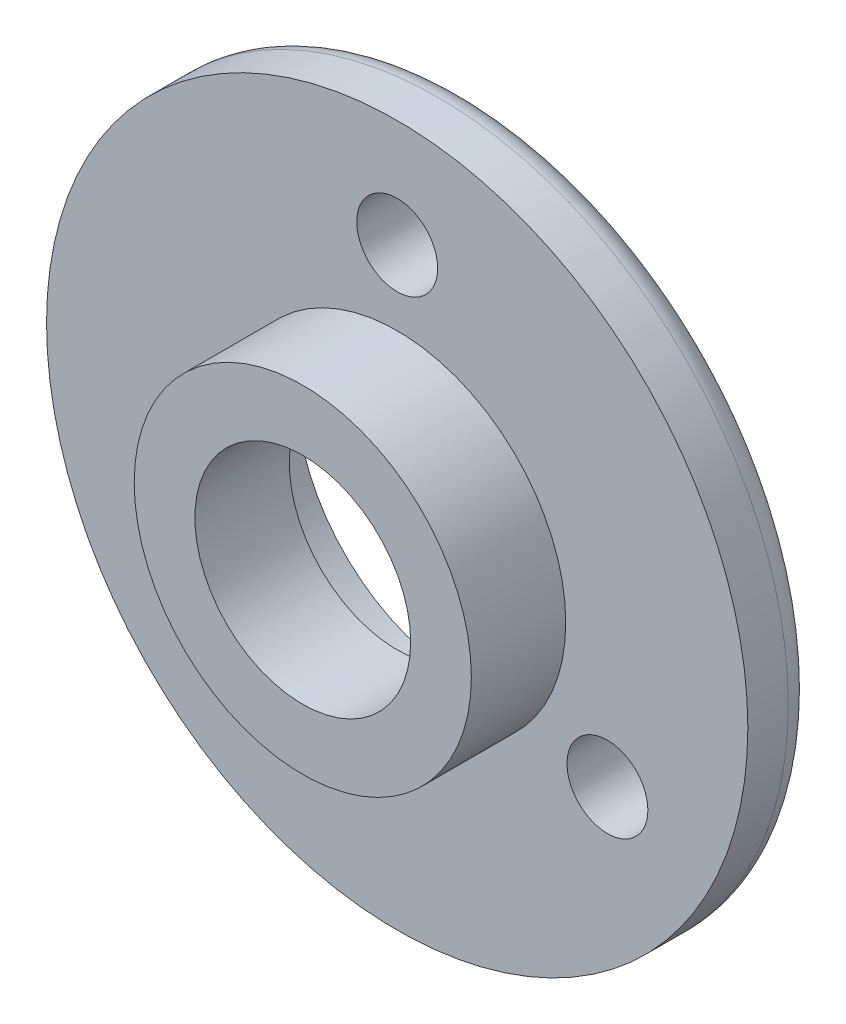
ISO-10303-21;
HEADER;
FILE_DESCRIPTION(('STEP AP214'),'2;1');
FILE_NAME('part.step','',(''),(''),'','','');
FILE_SCHEMA(('AUTOMOTIVE_DESIGN { 1 0 10303 214 1 1 1 1 }'));
ENDSEC;
DATA;
#1=APPLICATION_CONTEXT('core data for automotive mechanical design processes');
#2=APPLICATION_PROTOCOL_DEFINITION('international standard','automotive_design',2000,#1);
#3=PRODUCT_CONTEXT('',#1,'mechanical');
#4=PRODUCT('Part','Part','',(#3));
#5=PRODUCT_RELATED_PRODUCT_CATEGORY('part','',(#4));
#6=PRODUCT_DEFINITION_FORMATION('','',#4);
#7=PRODUCT_DEFINITION_CONTEXT('part definition',#1,'design');
#8=PRODUCT_DEFINITION('design','',#6,#7);
#9=PRODUCT_DEFINITION_SHAPE('','',#8);
#10=(LENGTH_UNIT() NAMED_UNIT(*) SI_UNIT(.MILLI.,.METRE.));
#11=(NAMED_UNIT(*) PLANE_ANGLE_UNIT() SI_UNIT($,.RADIAN.));
#12=(NAMED_UNIT(*) SI_UNIT($,.STERADIAN.) SOLID_ANGLE_UNIT());
#13=UNCERTAINTY_MEASURE_WITH_UNIT(LENGTH_MEASURE(1.E-05),#10,'distance_accuracy_value','');
#14=(GEOMETRIC_REPRESENTATION_CONTEXT(3) GLOBAL_UNCERTAINTY_ASSIGNED_CONTEXT((#13)) GLOBAL_UNIT_ASSIGNED_CONTEXT((#10,
#11,#12)) REPRESENTATION_CONTEXT('',''));
#15=CARTESIAN_POINT('',(0.,0.,0.));
#16=DIRECTION('',(0.,0.,1.));
#17=DIRECTION('',(1.,0.,0.));
#18=AXIS2_PLACEMENT_3D('',#15,#16,#17);
#19=CARTESIAN_POINT('',(0.,0.,5.));
#20=DIRECTION('',(0.,0.,-1.));
#21=DIRECTION('',(-1.,0.,0.));
#22=AXIS2_PLACEMENT_3D('',#19,#20,#21);
#23=CYLINDRICAL_SURFACE('',#22,26.);
#24=CARTESIAN_POINT('',(0.,0.,2.));
#25=DIRECTION('',(0.,0.,1.));
#26=DIRECTION('',(1.,0.,0.));
#27=AXIS2_PLACEMENT_3D('',#24,#25,#26);
#28=CIRCLE('',#27,26.);
#29=CARTESIAN_POINT('',(26.,0.,2.));
#30=VERTEX_POINT('',#29);
#31=EDGE_CURVE('E46',#30,#30,#28,.T.);
#32=ORIENTED_EDGE('',*,*,#31,.T.);
#33=EDGE_LOOP('',(#32));
#34=FACE_BOUND('',#33,.T.);
#35=CARTESIAN_POINT('',(0.,0.,5.));
#36=DIRECTION('',(0.,0.,1.));
#37=DIRECTION('',(1.,0.,0.));
#38=AXIS2_PLACEMENT_3D('',#35,#36,#37);
#39=CIRCLE('',#38,26.);
#40=CARTESIAN_POINT('',(26.,0.,5.));
#41=VERTEX_POINT('',#40);
#42=EDGE_CURVE('E65',#41,#41,#39,.T.);
#43=ORIENTED_EDGE('',*,*,#42,.F.);
#44=EDGE_LOOP('',(#43));
#45=FACE_BOUND('',#44,.T.);
#46=ADVANCED_FACE('F39',(#34,#45),#23,.T.);
#47=CARTESIAN_POINT('',(0.,0.,5.));
#48=DIRECTION('',(0.,0.,1.));
#49=DIRECTION('',(1.,0.,0.));
#50=AXIS2_PLACEMENT_3D('',#47,#48,#49);
#51=PLANE('',#50);
#52=CARTESIAN_POINT('',(0.,18.,5.));
#53=DIRECTION('',(0.,0.,1.));
#54=DIRECTION('',(1.,0.,0.));
#55=AXIS2_PLACEMENT_3D('',#52,#53,#54);
#56=CIRCLE('',#55,3.);
#57=CARTESIAN_POINT('',(3.,18.,5.));
#58=VERTEX_POINT('',#57);
#59=EDGE_CURVE('E50',#58,#58,#56,.T.);
#60=ORIENTED_EDGE('',*,*,#59,.F.);
#61=EDGE_LOOP('',(#60));
#62=FACE_BOUND('',#61,.T.);
#63=CARTESIAN_POINT('',(15.5884572681199,-9.,5.));
#64=DIRECTION('',(0.,0.,1.));
#65=DIRECTION('',(1.,0.,0.));
#66=AXIS2_PLACEMENT_3D('',#63,#64,#65);
#67=CIRCLE('',#66,3.);
#68=CARTESIAN_POINT('',(18.5884572681199,-9.,5.));
#69=VERTEX_POINT('',#68);
#70=EDGE_CURVE('E54',#69,#69,#67,.T.);
#71=ORIENTED_EDGE('',*,*,#70,.F.);
#72=EDGE_LOOP('',(#71));
#73=FACE_BOUND('',#72,.T.);
#74=CARTESIAN_POINT('',(-15.5884572681199,-9.00000000000001,5.));
#75=DIRECTION('',(0.,0.,1.));
#76=DIRECTION('',(1.,0.,0.));
#77=AXIS2_PLACEMENT_3D('',#74,#75,#76);
#78=CIRCLE('',#77,3.);
#79=CARTESIAN_POINT('',(-12.5884572681199,-9.00000000000001,5.));
#80=VERTEX_POINT('',#79);
#81=EDGE_CURVE('E60',#80,#80,#78,.T.);
#82=ORIENTED_EDGE('',*,*,#81,.F.);
#83=EDGE_LOOP('',(#82));
#84=FACE_BOUND('',#83,.T.);
#85=CARTESIAN_POINT('',(0.,0.,5.));
#86=DIRECTION('',(0.,0.,1.));
#87=DIRECTION('',(1.,0.,0.));
#88=AXIS2_PLACEMENT_3D('',#85,#86,#87);
#89=CIRCLE('',#88,12.5);
#90=CARTESIAN_POINT('',(12.5,0.,5.));
#91=VERTEX_POINT('',#90);
#92=EDGE_CURVE('E57',#91,#91,#89,.T.);
#93=ORIENTED_EDGE('',*,*,#92,.F.);
#94=EDGE_LOOP('',(#93));
#95=FACE_BOUND('',#94,.T.);
#96=ORIENTED_EDGE('',*,*,#42,.T.);
#97=EDGE_LOOP('',(#96));
#98=FACE_BOUND('',#97,.T.);
#99=ADVANCED_FACE('F81',(#62,#73,#84,#95,#98),#51,.T.);
#100=CARTESIAN_POINT('',(0.,0.,0.));
#101=DIRECTION('',(0.,0.,1.));
#102=DIRECTION('',(1.,0.,0.));
#103=AXIS2_PLACEMENT_3D('',#100,#101,#102);
#104=PLANE('',#103);
#105=CARTESIAN_POINT('',(0.,0.,0.));
#106=DIRECTION('',(0.,0.,1.));
#107=DIRECTION('',(1.,0.,0.));
#108=AXIS2_PLACEMENT_3D('',#105,#106,#107);
#109=CIRCLE('',#108,24.);
#110=CARTESIAN_POINT('',(24.,0.,0.));
#111=VERTEX_POINT('',#110);
#112=EDGE_CURVE('E11',#111,#111,#109,.F.);
#113=ORIENTED_EDGE('',*,*,#112,.T.);
#114=EDGE_LOOP('',(#113));
#115=FACE_BOUND('',#114,.T.);
#116=CARTESIAN_POINT('',(0.,18.,0.));
#117=DIRECTION('',(0.,0.,1.));
#118=DIRECTION('',(1.,0.,0.));
#119=AXIS2_PLACEMENT_3D('',#116,#117,#118);
#120=CIRCLE('',#119,3.);
#121=CARTESIAN_POINT('',(3.,18.,0.));
#122=VERTEX_POINT('',#121);
#123=EDGE_CURVE('E62',#122,#122,#120,.T.);
#124=ORIENTED_EDGE('',*,*,#123,.T.);
#125=EDGE_LOOP('',(#124));
#126=FACE_BOUND('',#125,.T.);
#127=CARTESIAN_POINT('',(0.,0.,0.));
#128=DIRECTION('',(0.,0.,1.));
#129=DIRECTION('',(1.,0.,0.));
#130=AXIS2_PLACEMENT_3D('',#127,#128,#129);
#131=CIRCLE('',#130,12.5);
#132=CARTESIAN_POINT('',(12.5,0.,0.));
#133=VERTEX_POINT('',#132);
#134=EDGE_CURVE('E64',#133,#133,#131,.T.);
#135=ORIENTED_EDGE('',*,*,#134,.T.);
#136=EDGE_LOOP('',(#135));
#137=FACE_BOUND('',#136,.T.);
#138=CARTESIAN_POINT('',(15.5884572681199,-9.,0.));
#139=DIRECTION('',(0.,0.,1.));
#140=DIRECTION('',(1.,0.,0.));
#141=AXIS2_PLACEMENT_3D('',#138,#139,#140);
#142=CIRCLE('',#141,3.);
#143=CARTESIAN_POINT('',(18.5884572681199,-9.,0.));
#144=VERTEX_POINT('',#143);
#145=EDGE_CURVE('E69',#144,#144,#142,.T.);
#146=ORIENTED_EDGE('',*,*,#145,.T.);
#147=EDGE_LOOP('',(#146));
#148=FACE_BOUND('',#147,.T.);
#149=CARTESIAN_POINT('',(-15.5884572681199,-9.00000000000001,0.));
#150=DIRECTION('',(0.,0.,1.));
#151=DIRECTION('',(1.,0.,0.));
#152=AXIS2_PLACEMENT_3D('',#149,#150,#151);
#153=CIRCLE('',#152,3.);
#154=CARTESIAN_POINT('',(-12.5884572681199,-9.00000000000001,0.));
#155=VERTEX_POINT('',#154);
#156=EDGE_CURVE('E61',#155,#155,#153,.T.);
#157=ORIENTED_EDGE('',*,*,#156,.T.);
#158=EDGE_LOOP('',(#157));
#159=FACE_BOUND('',#158,.T.);
#160=ADVANCED_FACE('F88',(#115,#126,#137,#148,#159),#104,.F.);
#161=CARTESIAN_POINT('',(0.,0.,0.));
#162=DIRECTION('',(0.,0.,1.));
#163=DIRECTION('',(1.,0.,0.));
#164=AXIS2_PLACEMENT_3D('',#161,#162,#163);
#165=CYLINDRICAL_SURFACE('',#164,12.5);
#166=ORIENTED_EDGE('',*,*,#134,.F.);
#167=EDGE_LOOP('',(#166));
#168=FACE_BOUND('',#167,.T.);
#169=ORIENTED_EDGE('',*,*,#92,.T.);
#170=EDGE_LOOP('',(#169));
#171=FACE_BOUND('',#170,.T.);
#172=ADVANCED_FACE('F93',(#168,#171),#165,.F.);
#173=CARTESIAN_POINT('',(-15.5884572681199,-9.00000000000001,0.));
#174=DIRECTION('',(0.,0.,1.));
#175=DIRECTION('',(1.,0.,0.));
#176=AXIS2_PLACEMENT_3D('',#173,#174,#175);
#177=CYLINDRICAL_SURFACE('',#176,3.);
#178=ORIENTED_EDGE('',*,*,#156,.F.);
#179=EDGE_LOOP('',(#178));
#180=FACE_BOUND('',#179,.T.);
#181=ORIENTED_EDGE('',*,*,#81,.T.);
#182=EDGE_LOOP('',(#181));
#183=FACE_BOUND('',#182,.T.);
#184=ADVANCED_FACE('F95',(#180,#183),#177,.F.);
#185=CARTESIAN_POINT('',(15.5884572681199,-9.,0.));
#186=DIRECTION('',(0.,0.,1.));
#187=DIRECTION('',(1.,0.,0.));
#188=AXIS2_PLACEMENT_3D('',#185,#186,#187);
#189=CYLINDRICAL_SURFACE('',#188,3.);
#190=ORIENTED_EDGE('',*,*,#145,.F.);
#191=EDGE_LOOP('',(#190));
#192=FACE_BOUND('',#191,.T.);
#193=ORIENTED_EDGE('',*,*,#70,.T.);
#194=EDGE_LOOP('',(#193));
#195=FACE_BOUND('',#194,.T.);
#196=ADVANCED_FACE('F98',(#192,#195),#189,.F.);
#197=CARTESIAN_POINT('',(0.,18.,0.));
#198=DIRECTION('',(0.,0.,1.));
#199=DIRECTION('',(1.,0.,0.));
#200=AXIS2_PLACEMENT_3D('',#197,#198,#199);
#201=CYLINDRICAL_SURFACE('',#200,3.);
#202=ORIENTED_EDGE('',*,*,#123,.F.);
#203=EDGE_LOOP('',(#202));
#204=FACE_BOUND('',#203,.T.);
#205=ORIENTED_EDGE('',*,*,#59,.T.);
#206=EDGE_LOOP('',(#205));
#207=FACE_BOUND('',#206,.T.);
#208=ADVANCED_FACE('F102',(#204,#207),#201,.F.);
#209=CARTESIAN_POINT('',(0.,0.,2.));
#210=DIRECTION('',(0.,0.,1.));
#211=DIRECTION('',(1.,0.,0.));
#212=AXIS2_PLACEMENT_3D('',#209,#210,#211);
#213=TOROIDAL_SURFACE('',#212,24.,2.);
#214=ORIENTED_EDGE('',*,*,#112,.F.);
#215=EDGE_LOOP('',(#214));
#216=FACE_BOUND('',#215,.T.);
#217=ORIENTED_EDGE('',*,*,#31,.F.);
#218=EDGE_LOOP('',(#217));
#219=FACE_BOUND('',#218,.T.);
#220=ADVANCED_FACE('F41',(#216,#219),#213,.T.);
#221=CLOSED_SHELL('',(#46,#99,#160,#172,#184,#196,#208,#220));
#222=MANIFOLD_SOLID_BREP('B2',#221);
#223=CARTESIAN_POINT('',(0.,0.,12.));
#224=DIRECTION('',(0.,0.,-1.));
#225=DIRECTION('',(-1.,0.,0.));
#226=AXIS2_PLACEMENT_3D('',#223,#224,#225);
#227=CYLINDRICAL_SURFACE('',#226,12.5);
#228=CARTESIAN_POINT('',(0.,0.,12.));
#229=DIRECTION('',(0.,0.,1.));
#230=DIRECTION('',(1.,0.,0.));
#231=AXIS2_PLACEMENT_3D('',#228,#229,#230);
#232=CIRCLE('',#231,12.5);
#233=CARTESIAN_POINT('',(12.5,0.,12.));
#234=VERTEX_POINT('',#233);
#235=EDGE_CURVE('E38',#234,#234,#232,.T.);
#236=ORIENTED_EDGE('',*,*,#235,.F.);
#237=EDGE_LOOP('',(#236));
#238=FACE_BOUND('',#237,.T.);
#239=CARTESIAN_POINT('',(0.,0.,5.));
#240=DIRECTION('',(0.,0.,1.));
#241=DIRECTION('',(1.,0.,0.));
#242=AXIS2_PLACEMENT_3D('',#239,#240,#241);
#243=CIRCLE('',#242,12.5);
#244=CARTESIAN_POINT('',(12.5,0.,5.));
#245=VERTEX_POINT('',#244);
#246=EDGE_CURVE('E192',#245,#245,#243,.T.);
#247=ORIENTED_EDGE('',*,*,#246,.T.);
#248=EDGE_LOOP('',(#247));
#249=FACE_BOUND('',#248,.T.);
#250=ADVANCED_FACE('F179',(#238,#249),#227,.T.);
#251=CARTESIAN_POINT('',(0.,0.,12.));
#252=DIRECTION('',(0.,0.,1.));
#253=DIRECTION('',(1.,0.,0.));
#254=AXIS2_PLACEMENT_3D('',#251,#252,#253);
#255=PLANE('',#254);
#256=CARTESIAN_POINT('',(0.,0.,12.));
#257=DIRECTION('',(0.,0.,1.));
#258=DIRECTION('',(1.,0.,0.));
#259=AXIS2_PLACEMENT_3D('',#256,#257,#258);
#260=CIRCLE('',#259,8.);
#261=CARTESIAN_POINT('',(8.,0.,12.));
#262=VERTEX_POINT('',#261);
#263=EDGE_CURVE('E186',#262,#262,#260,.T.);
#264=ORIENTED_EDGE('',*,*,#263,.F.);
#265=EDGE_LOOP('',(#264));
#266=FACE_BOUND('',#265,.T.);
#267=ORIENTED_EDGE('',*,*,#235,.T.);
#268=EDGE_LOOP('',(#267));
#269=FACE_BOUND('',#268,.T.);
#270=ADVANCED_FACE('F209',(#266,#269),#255,.T.);
#271=CARTESIAN_POINT('',(0.,0.,0.));
#272=DIRECTION('',(0.,0.,1.));
#273=DIRECTION('',(1.,0.,0.));
#274=AXIS2_PLACEMENT_3D('',#271,#272,#273);
#275=CYLINDRICAL_SURFACE('',#274,8.);
#276=CARTESIAN_POINT('',(0.,0.,5.));
#277=DIRECTION('',(0.,0.,1.));
#278=DIRECTION('',(1.,0.,0.));
#279=AXIS2_PLACEMENT_3D('',#276,#277,#278);
#280=CIRCLE('',#279,8.);
#281=CARTESIAN_POINT('',(8.,0.,5.));
#282=VERTEX_POINT('',#281);
#283=EDGE_CURVE('E182',#282,#282,#280,.F.);
#284=ORIENTED_EDGE('',*,*,#283,.T.);
#285=EDGE_LOOP('',(#284));
#286=FACE_BOUND('',#285,.T.);
#287=ORIENTED_EDGE('',*,*,#263,.T.);
#288=EDGE_LOOP('',(#287));
#289=FACE_BOUND('',#288,.T.);
#290=ADVANCED_FACE('F199',(#286,#289),#275,.F.);
#291=CARTESIAN_POINT('',(0.,0.,5.));
#292=DIRECTION('',(0.,0.,1.));
#293=DIRECTION('',(1.,0.,0.));
#294=AXIS2_PLACEMENT_3D('',#291,#292,#293);
#295=PLANE('',#294);
#296=ORIENTED_EDGE('',*,*,#246,.F.);
#297=EDGE_LOOP('',(#296));
#298=FACE_BOUND('',#297,.T.);
#299=ORIENTED_EDGE('',*,*,#283,.F.);
#300=EDGE_LOOP('',(#299));
#301=FACE_BOUND('',#300,.T.);
#302=ADVANCED_FACE('F202',(#298,#301),#295,.F.);
#303=CLOSED_SHELL('',(#250,#270,#290,#302));
#304=MANIFOLD_SOLID_BREP('B6',#303);
#305=ADVANCED_BREP_SHAPE_REPRESENTATION('',(#18,#222,#304),#14);
#306=SHAPE_DEFINITION_REPRESENTATION(#9,#305);
ENDSEC;
END-ISO-10303-21;
